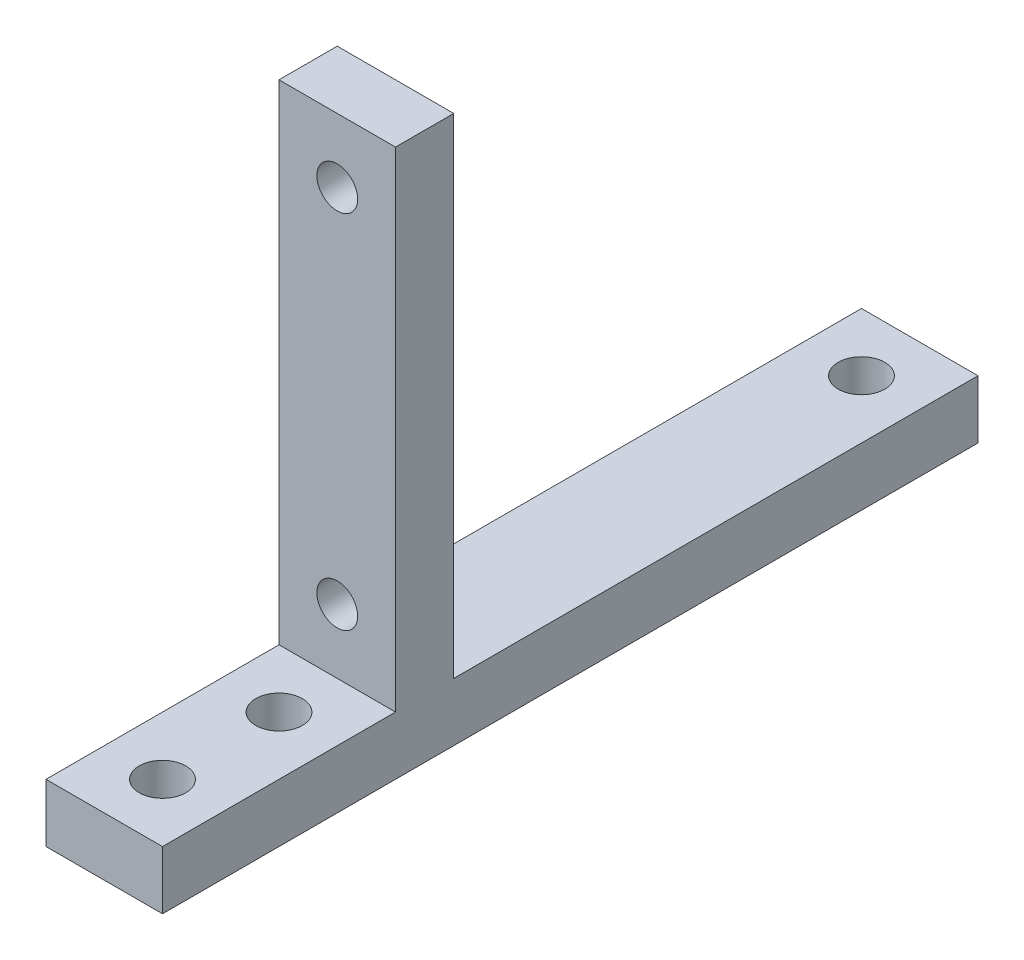
ISO-10303-21;
HEADER;
FILE_DESCRIPTION(('STEP AP214'),'2;1');
FILE_NAME('part.step','',(''),(''),'','','');
FILE_SCHEMA(('AUTOMOTIVE_DESIGN { 1 0 10303 214 1 1 1 1 }'));
ENDSEC;
DATA;
#1=APPLICATION_CONTEXT('core data for automotive mechanical design processes');
#2=APPLICATION_PROTOCOL_DEFINITION('international standard','automotive_design',2000,#1);
#3=PRODUCT_CONTEXT('',#1,'mechanical');
#4=PRODUCT('Part','Part','',(#3));
#5=PRODUCT_RELATED_PRODUCT_CATEGORY('part','',(#4));
#6=PRODUCT_DEFINITION_FORMATION('','',#4);
#7=PRODUCT_DEFINITION_CONTEXT('part definition',#1,'design');
#8=PRODUCT_DEFINITION('design','',#6,#7);
#9=PRODUCT_DEFINITION_SHAPE('','',#8);
#10=(LENGTH_UNIT() NAMED_UNIT(*) SI_UNIT(.MILLI.,.METRE.));
#11=(NAMED_UNIT(*) PLANE_ANGLE_UNIT() SI_UNIT($,.RADIAN.));
#12=(NAMED_UNIT(*) SI_UNIT($,.STERADIAN.) SOLID_ANGLE_UNIT());
#13=UNCERTAINTY_MEASURE_WITH_UNIT(LENGTH_MEASURE(1.E-05),#10,'distance_accuracy_value','');
#14=(GEOMETRIC_REPRESENTATION_CONTEXT(3) GLOBAL_UNCERTAINTY_ASSIGNED_CONTEXT((#13)) GLOBAL_UNIT_ASSIGNED_CONTEXT((#10,
#11,#12)) REPRESENTATION_CONTEXT('',''));
#15=CARTESIAN_POINT('',(0.,0.,0.));
#16=DIRECTION('',(0.,0.,1.));
#17=DIRECTION('',(1.,0.,0.));
#18=AXIS2_PLACEMENT_3D('',#15,#16,#17);
#19=CARTESIAN_POINT('',(0.,0.,5.));
#20=DIRECTION('',(0.,0.,1.));
#21=DIRECTION('',(1.,0.,0.));
#22=AXIS2_PLACEMENT_3D('',#19,#20,#21);
#23=PLANE('',#22);
#24=CARTESIAN_POINT('',(0.,15.5,5.));
#25=DIRECTION('',(0.,0.,1.));
#26=DIRECTION('',(1.,0.,0.));
#27=AXIS2_PLACEMENT_3D('',#24,#25,#26);
#28=CIRCLE('',#27,1.75);
#29=CARTESIAN_POINT('',(1.75,15.5,5.));
#30=VERTEX_POINT('',#29);
#31=EDGE_CURVE('E111',#30,#30,#28,.T.);
#32=ORIENTED_EDGE('',*,*,#31,.F.);
#33=EDGE_LOOP('',(#32));
#34=FACE_BOUND('',#33,.T.);
#35=DIRECTION('',(0.,-1.,0.));
#36=VECTOR('',#35,1.);
#37=CARTESIAN_POINT('',(-4.99999999999999,21.,5.));
#38=LINE('',#37,#36);
#39=CARTESIAN_POINT('',(-4.99999999999999,21.,5.));
#40=VERTEX_POINT('',#39);
#41=CARTESIAN_POINT('',(-4.99999999999999,-21.,5.));
#42=VERTEX_POINT('',#41);
#43=EDGE_CURVE('E101',#40,#42,#38,.T.);
#44=ORIENTED_EDGE('',*,*,#43,.T.);
#45=DIRECTION('',(1.,0.,0.));
#46=VECTOR('',#45,1.);
#47=CARTESIAN_POINT('',(-5.,-21.,5.));
#48=LINE('',#47,#46);
#49=CARTESIAN_POINT('',(5.00000000000001,-21.,5.));
#50=VERTEX_POINT('',#49);
#51=EDGE_CURVE('E87',#42,#50,#48,.T.);
#52=ORIENTED_EDGE('',*,*,#51,.T.);
#53=DIRECTION('',(0.,1.,0.));
#54=VECTOR('',#53,1.);
#55=CARTESIAN_POINT('',(5.00000000000001,-21.,5.));
#56=LINE('',#55,#54);
#57=CARTESIAN_POINT('',(5.00000000000001,21.,5.));
#58=VERTEX_POINT('',#57);
#59=EDGE_CURVE('E99',#50,#58,#56,.T.);
#60=ORIENTED_EDGE('',*,*,#59,.T.);
#61=DIRECTION('',(-1.,0.,0.));
#62=VECTOR('',#61,1.);
#63=CARTESIAN_POINT('',(-4.99999999999999,21.,5.));
#64=LINE('',#63,#62);
#65=EDGE_CURVE('E52',#58,#40,#64,.T.);
#66=ORIENTED_EDGE('',*,*,#65,.T.);
#67=EDGE_LOOP('',(#44,#52,#60,#66));
#68=FACE_BOUND('',#67,.T.);
#69=CARTESIAN_POINT('',(0.,-15.5,5.));
#70=DIRECTION('',(0.,0.,1.));
#71=DIRECTION('',(1.,0.,0.));
#72=AXIS2_PLACEMENT_3D('',#69,#70,#71);
#73=CIRCLE('',#72,1.75);
#74=CARTESIAN_POINT('',(1.75,-15.5,5.));
#75=VERTEX_POINT('',#74);
#76=EDGE_CURVE('E228',#75,#75,#73,.T.);
#77=ORIENTED_EDGE('',*,*,#76,.F.);
#78=EDGE_LOOP('',(#77));
#79=FACE_BOUND('',#78,.T.);
#80=ADVANCED_FACE('F35',(#34,#68,#79),#23,.T.);
#81=CARTESIAN_POINT('',(0.,0.,0.));
#82=DIRECTION('',(0.,0.,1.));
#83=DIRECTION('',(1.,0.,0.));
#84=AXIS2_PLACEMENT_3D('',#81,#82,#83);
#85=PLANE('',#84);
#86=DIRECTION('',(0.,-1.,0.));
#87=VECTOR('',#86,1.);
#88=CARTESIAN_POINT('',(-4.99999999999999,21.,0.));
#89=LINE('',#88,#87);
#90=CARTESIAN_POINT('',(-4.99999999999999,21.,0.));
#91=VERTEX_POINT('',#90);
#92=CARTESIAN_POINT('',(-4.99999999999999,-21.,0.));
#93=VERTEX_POINT('',#92);
#94=EDGE_CURVE('E108',#91,#93,#89,.T.);
#95=ORIENTED_EDGE('',*,*,#94,.F.);
#96=DIRECTION('',(-1.,0.,0.));
#97=VECTOR('',#96,1.);
#98=CARTESIAN_POINT('',(-4.99999999999999,21.,0.));
#99=LINE('',#98,#97);
#100=CARTESIAN_POINT('',(5.00000000000001,21.,0.));
#101=VERTEX_POINT('',#100);
#102=EDGE_CURVE('E114',#101,#91,#99,.T.);
#103=ORIENTED_EDGE('',*,*,#102,.F.);
#104=DIRECTION('',(0.,1.,0.));
#105=VECTOR('',#104,1.);
#106=CARTESIAN_POINT('',(5.00000000000001,-21.,0.));
#107=LINE('',#106,#105);
#108=CARTESIAN_POINT('',(5.00000000000001,-21.,0.));
#109=VERTEX_POINT('',#108);
#110=EDGE_CURVE('E64',#109,#101,#107,.T.);
#111=ORIENTED_EDGE('',*,*,#110,.F.);
#112=DIRECTION('',(1.,0.,0.));
#113=VECTOR('',#112,1.);
#114=CARTESIAN_POINT('',(-5.,-21.,0.));
#115=LINE('',#114,#113);
#116=EDGE_CURVE('E73',#93,#109,#115,.T.);
#117=ORIENTED_EDGE('',*,*,#116,.F.);
#118=EDGE_LOOP('',(#95,#103,#111,#117));
#119=FACE_BOUND('',#118,.T.);
#120=CARTESIAN_POINT('',(0.,15.5,0.));
#121=DIRECTION('',(0.,0.,1.));
#122=DIRECTION('',(1.,0.,0.));
#123=AXIS2_PLACEMENT_3D('',#120,#121,#122);
#124=CIRCLE('',#123,1.75);
#125=CARTESIAN_POINT('',(1.75,15.5,0.));
#126=VERTEX_POINT('',#125);
#127=EDGE_CURVE('E231',#126,#126,#124,.T.);
#128=ORIENTED_EDGE('',*,*,#127,.T.);
#129=EDGE_LOOP('',(#128));
#130=FACE_BOUND('',#129,.T.);
#131=CARTESIAN_POINT('',(0.,-15.5,0.));
#132=DIRECTION('',(0.,0.,1.));
#133=DIRECTION('',(1.,0.,0.));
#134=AXIS2_PLACEMENT_3D('',#131,#132,#133);
#135=CIRCLE('',#134,1.75);
#136=CARTESIAN_POINT('',(1.75,-15.5,0.));
#137=VERTEX_POINT('',#136);
#138=EDGE_CURVE('E227',#137,#137,#135,.T.);
#139=ORIENTED_EDGE('',*,*,#138,.T.);
#140=EDGE_LOOP('',(#139));
#141=FACE_BOUND('',#140,.T.);
#142=ADVANCED_FACE('F122',(#119,#130,#141),#85,.F.);
#143=CARTESIAN_POINT('',(-4.99999999999999,21.,5.));
#144=DIRECTION('',(1.,0.,0.));
#145=DIRECTION('',(0.,1.,0.));
#146=AXIS2_PLACEMENT_3D('',#143,#144,#145);
#147=PLANE('',#146);
#148=ORIENTED_EDGE('',*,*,#94,.T.);
#149=DIRECTION('',(0.,0.,-1.));
#150=VECTOR('',#149,1.);
#151=CARTESIAN_POINT('',(-5.,-21.,25.));
#152=LINE('',#151,#150);
#153=CARTESIAN_POINT('',(-4.99999999999999,-21.,-45.));
#154=VERTEX_POINT('',#153);
#155=EDGE_CURVE('E196',#93,#154,#152,.T.);
#156=ORIENTED_EDGE('',*,*,#155,.T.);
#157=DIRECTION('',(0.,1.,0.));
#158=VECTOR('',#157,1.);
#159=CARTESIAN_POINT('',(-4.99999999999999,-26.,-45.));
#160=LINE('',#159,#158);
#161=CARTESIAN_POINT('',(-4.99999999999999,-26.,-45.));
#162=VERTEX_POINT('',#161);
#163=EDGE_CURVE('E224',#162,#154,#160,.T.);
#164=ORIENTED_EDGE('',*,*,#163,.F.);
#165=DIRECTION('',(0.,0.,-1.));
#166=VECTOR('',#165,1.);
#167=CARTESIAN_POINT('',(-5.,-26.,25.));
#168=LINE('',#167,#166);
#169=CARTESIAN_POINT('',(-5.,-26.,25.));
#170=VERTEX_POINT('',#169);
#171=EDGE_CURVE('E199',#170,#162,#168,.T.);
#172=ORIENTED_EDGE('',*,*,#171,.F.);
#173=DIRECTION('',(0.,1.,0.));
#174=VECTOR('',#173,1.);
#175=CARTESIAN_POINT('',(-5.,-26.,25.));
#176=LINE('',#175,#174);
#177=CARTESIAN_POINT('',(-5.,-21.,25.));
#178=VERTEX_POINT('',#177);
#179=EDGE_CURVE('E211',#170,#178,#176,.T.);
#180=ORIENTED_EDGE('',*,*,#179,.T.);
#181=EDGE_CURVE('E212',#178,#42,#152,.T.);
#182=ORIENTED_EDGE('',*,*,#181,.T.);
#183=ORIENTED_EDGE('',*,*,#43,.F.);
#184=DIRECTION('',(0.,0.,-1.));
#185=VECTOR('',#184,1.);
#186=CARTESIAN_POINT('',(-4.99999999999999,21.,5.));
#187=LINE('',#186,#185);
#188=EDGE_CURVE('E44',#40,#91,#187,.T.);
#189=ORIENTED_EDGE('',*,*,#188,.T.);
#190=EDGE_LOOP('',(#148,#156,#164,#172,#180,#182,#183,#189));
#191=FACE_BOUND('',#190,.T.);
#192=ADVANCED_FACE('F37',(#191),#147,.F.);
#193=CARTESIAN_POINT('',(5.00000000000001,-21.,5.));
#194=DIRECTION('',(-1.,0.,0.));
#195=DIRECTION('',(0.,-1.,0.));
#196=AXIS2_PLACEMENT_3D('',#193,#194,#195);
#197=PLANE('',#196);
#198=ORIENTED_EDGE('',*,*,#110,.T.);
#199=DIRECTION('',(0.,0.,-1.));
#200=VECTOR('',#199,1.);
#201=CARTESIAN_POINT('',(5.00000000000001,21.,5.));
#202=LINE('',#201,#200);
#203=EDGE_CURVE('E11',#58,#101,#202,.T.);
#204=ORIENTED_EDGE('',*,*,#203,.F.);
#205=ORIENTED_EDGE('',*,*,#59,.F.);
#206=DIRECTION('',(0.,0.,1.));
#207=VECTOR('',#206,1.);
#208=CARTESIAN_POINT('',(5.00000000000001,-21.,25.));
#209=LINE('',#208,#207);
#210=CARTESIAN_POINT('',(5.00000000000001,-21.,25.));
#211=VERTEX_POINT('',#210);
#212=EDGE_CURVE('E82',#50,#211,#209,.T.);
#213=ORIENTED_EDGE('',*,*,#212,.T.);
#214=DIRECTION('',(0.,1.,0.));
#215=VECTOR('',#214,1.);
#216=CARTESIAN_POINT('',(5.00000000000001,-26.,25.));
#217=LINE('',#216,#215);
#218=CARTESIAN_POINT('',(5.00000000000001,-26.,25.));
#219=VERTEX_POINT('',#218);
#220=EDGE_CURVE('E219',#219,#211,#217,.T.);
#221=ORIENTED_EDGE('',*,*,#220,.F.);
#222=DIRECTION('',(0.,0.,1.));
#223=VECTOR('',#222,1.);
#224=CARTESIAN_POINT('',(5.00000000000001,-26.,25.));
#225=LINE('',#224,#223);
#226=CARTESIAN_POINT('',(5.00000000000002,-26.,-45.));
#227=VERTEX_POINT('',#226);
#228=EDGE_CURVE('E205',#227,#219,#225,.T.);
#229=ORIENTED_EDGE('',*,*,#228,.F.);
#230=DIRECTION('',(0.,1.,0.));
#231=VECTOR('',#230,1.);
#232=CARTESIAN_POINT('',(5.00000000000002,-26.,-45.));
#233=LINE('',#232,#231);
#234=CARTESIAN_POINT('',(5.00000000000002,-21.,-45.));
#235=VERTEX_POINT('',#234);
#236=EDGE_CURVE('E221',#227,#235,#233,.T.);
#237=ORIENTED_EDGE('',*,*,#236,.T.);
#238=EDGE_CURVE('E95',#235,#109,#209,.T.);
#239=ORIENTED_EDGE('',*,*,#238,.T.);
#240=EDGE_LOOP('',(#198,#204,#205,#213,#221,#229,#237,#239));
#241=FACE_BOUND('',#240,.T.);
#242=ADVANCED_FACE('F103',(#241),#197,.F.);
#243=CARTESIAN_POINT('',(-4.99999999999999,21.,5.));
#244=DIRECTION('',(0.,-1.,0.));
#245=DIRECTION('',(0.,0.,-1.));
#246=AXIS2_PLACEMENT_3D('',#243,#244,#245);
#247=PLANE('',#246);
#248=ORIENTED_EDGE('',*,*,#102,.T.);
#249=ORIENTED_EDGE('',*,*,#188,.F.);
#250=ORIENTED_EDGE('',*,*,#65,.F.);
#251=ORIENTED_EDGE('',*,*,#203,.T.);
#252=EDGE_LOOP('',(#248,#249,#250,#251));
#253=FACE_BOUND('',#252,.T.);
#254=ADVANCED_FACE('F124',(#253),#247,.F.);
#255=CARTESIAN_POINT('',(0.,15.5,5.));
#256=DIRECTION('',(0.,0.,-1.));
#257=DIRECTION('',(-1.,0.,0.));
#258=AXIS2_PLACEMENT_3D('',#255,#256,#257);
#259=CYLINDRICAL_SURFACE('',#258,1.75);
#260=ORIENTED_EDGE('',*,*,#31,.T.);
#261=EDGE_LOOP('',(#260));
#262=FACE_BOUND('',#261,.T.);
#263=ORIENTED_EDGE('',*,*,#127,.F.);
#264=EDGE_LOOP('',(#263));
#265=FACE_BOUND('',#264,.T.);
#266=ADVANCED_FACE('F126',(#262,#265),#259,.F.);
#267=CARTESIAN_POINT('',(0.,-15.5,5.));
#268=DIRECTION('',(0.,0.,-1.));
#269=DIRECTION('',(-1.,0.,0.));
#270=AXIS2_PLACEMENT_3D('',#267,#268,#269);
#271=CYLINDRICAL_SURFACE('',#270,1.75);
#272=ORIENTED_EDGE('',*,*,#76,.T.);
#273=EDGE_LOOP('',(#272));
#274=FACE_BOUND('',#273,.T.);
#275=ORIENTED_EDGE('',*,*,#138,.F.);
#276=EDGE_LOOP('',(#275));
#277=FACE_BOUND('',#276,.T.);
#278=ADVANCED_FACE('F132',(#274,#277),#271,.F.);
#279=CARTESIAN_POINT('',(0.,-21.,0.));
#280=DIRECTION('',(0.,-1.,0.));
#281=DIRECTION('',(0.,0.,-1.));
#282=AXIS2_PLACEMENT_3D('',#279,#280,#281);
#283=PLANE('',#282);
#284=CARTESIAN_POINT('',(0.,-21.,-40.));
#285=DIRECTION('',(0.,-1.,0.));
#286=DIRECTION('',(0.,0.,-1.));
#287=AXIS2_PLACEMENT_3D('',#284,#285,#286);
#288=CIRCLE('',#287,2.);
#289=CARTESIAN_POINT('',(0.,-21.,-42.));
#290=VERTEX_POINT('',#289);
#291=EDGE_CURVE('E184',#290,#290,#288,.T.);
#292=ORIENTED_EDGE('',*,*,#291,.T.);
#293=EDGE_LOOP('',(#292));
#294=FACE_BOUND('',#293,.T.);
#295=ORIENTED_EDGE('',*,*,#155,.F.);
#296=ORIENTED_EDGE('',*,*,#116,.T.);
#297=ORIENTED_EDGE('',*,*,#238,.F.);
#298=DIRECTION('',(1.,0.,0.));
#299=VECTOR('',#298,1.);
#300=CARTESIAN_POINT('',(-4.99999999999999,-21.,-45.));
#301=LINE('',#300,#299);
#302=EDGE_CURVE('E96',#154,#235,#301,.T.);
#303=ORIENTED_EDGE('',*,*,#302,.F.);
#304=EDGE_LOOP('',(#295,#296,#297,#303));
#305=FACE_BOUND('',#304,.T.);
#306=ADVANCED_FACE('F146',(#294,#305),#283,.F.);
#307=CARTESIAN_POINT('',(0.,-26.,0.));
#308=DIRECTION('',(0.,-1.,0.));
#309=DIRECTION('',(0.,0.,-1.));
#310=AXIS2_PLACEMENT_3D('',#307,#308,#309);
#311=PLANE('',#310);
#312=CARTESIAN_POINT('',(0.,-26.,-40.));
#313=DIRECTION('',(0.,-1.,0.));
#314=DIRECTION('',(0.,0.,-1.));
#315=AXIS2_PLACEMENT_3D('',#312,#313,#314);
#316=CIRCLE('',#315,2.);
#317=CARTESIAN_POINT('',(0.,-26.,-42.));
#318=VERTEX_POINT('',#317);
#319=EDGE_CURVE('E187',#318,#318,#316,.T.);
#320=ORIENTED_EDGE('',*,*,#319,.F.);
#321=EDGE_LOOP('',(#320));
#322=FACE_BOUND('',#321,.T.);
#323=ORIENTED_EDGE('',*,*,#171,.T.);
#324=DIRECTION('',(1.,0.,0.));
#325=VECTOR('',#324,1.);
#326=CARTESIAN_POINT('',(-4.99999999999999,-26.,-45.));
#327=LINE('',#326,#325);
#328=EDGE_CURVE('E202',#162,#227,#327,.T.);
#329=ORIENTED_EDGE('',*,*,#328,.T.);
#330=ORIENTED_EDGE('',*,*,#228,.T.);
#331=DIRECTION('',(-1.,0.,0.));
#332=VECTOR('',#331,1.);
#333=CARTESIAN_POINT('',(-5.,-26.,25.));
#334=LINE('',#333,#332);
#335=EDGE_CURVE('E208',#219,#170,#334,.T.);
#336=ORIENTED_EDGE('',*,*,#335,.T.);
#337=EDGE_LOOP('',(#323,#329,#330,#336));
#338=FACE_BOUND('',#337,.T.);
#339=CARTESIAN_POINT('',(0.,-26.,20.));
#340=DIRECTION('',(0.,-1.,0.));
#341=DIRECTION('',(0.,0.,-1.));
#342=AXIS2_PLACEMENT_3D('',#339,#340,#341);
#343=CIRCLE('',#342,2.);
#344=CARTESIAN_POINT('',(0.,-26.,18.));
#345=VERTEX_POINT('',#344);
#346=EDGE_CURVE('E193',#345,#345,#343,.T.);
#347=ORIENTED_EDGE('',*,*,#346,.F.);
#348=EDGE_LOOP('',(#347));
#349=FACE_BOUND('',#348,.T.);
#350=CARTESIAN_POINT('',(0.,-26.,10.));
#351=DIRECTION('',(0.,-1.,0.));
#352=DIRECTION('',(0.,0.,-1.));
#353=AXIS2_PLACEMENT_3D('',#350,#351,#352);
#354=CIRCLE('',#353,2.);
#355=CARTESIAN_POINT('',(0.,-26.,8.));
#356=VERTEX_POINT('',#355);
#357=EDGE_CURVE('E178',#356,#356,#354,.T.);
#358=ORIENTED_EDGE('',*,*,#357,.F.);
#359=EDGE_LOOP('',(#358));
#360=FACE_BOUND('',#359,.T.);
#361=ADVANCED_FACE('F159',(#322,#338,#349,#360),#311,.T.);
#362=ORIENTED_EDGE('',*,*,#51,.F.);
#363=ORIENTED_EDGE('',*,*,#181,.F.);
#364=DIRECTION('',(-1.,0.,0.));
#365=VECTOR('',#364,1.);
#366=CARTESIAN_POINT('',(-5.,-21.,25.));
#367=LINE('',#366,#365);
#368=EDGE_CURVE('E91',#211,#178,#367,.T.);
#369=ORIENTED_EDGE('',*,*,#368,.F.);
#370=ORIENTED_EDGE('',*,*,#212,.F.);
#371=EDGE_LOOP('',(#362,#363,#369,#370));
#372=FACE_BOUND('',#371,.T.);
#373=CARTESIAN_POINT('',(0.,-21.,20.));
#374=DIRECTION('',(0.,-1.,0.));
#375=DIRECTION('',(0.,0.,-1.));
#376=AXIS2_PLACEMENT_3D('',#373,#374,#375);
#377=CIRCLE('',#376,2.);
#378=CARTESIAN_POINT('',(0.,-21.,18.));
#379=VERTEX_POINT('',#378);
#380=EDGE_CURVE('E190',#379,#379,#377,.T.);
#381=ORIENTED_EDGE('',*,*,#380,.T.);
#382=EDGE_LOOP('',(#381));
#383=FACE_BOUND('',#382,.T.);
#384=CARTESIAN_POINT('',(0.,-21.,10.));
#385=DIRECTION('',(0.,-1.,0.));
#386=DIRECTION('',(0.,0.,-1.));
#387=AXIS2_PLACEMENT_3D('',#384,#385,#386);
#388=CIRCLE('',#387,2.);
#389=CARTESIAN_POINT('',(0.,-21.,8.));
#390=VERTEX_POINT('',#389);
#391=EDGE_CURVE('E181',#390,#390,#388,.T.);
#392=ORIENTED_EDGE('',*,*,#391,.T.);
#393=EDGE_LOOP('',(#392));
#394=FACE_BOUND('',#393,.T.);
#395=ADVANCED_FACE('F84',(#372,#383,#394),#283,.F.);
#396=CARTESIAN_POINT('',(-4.99999999999999,-26.,-45.));
#397=DIRECTION('',(0.,0.,1.));
#398=DIRECTION('',(1.,0.,0.));
#399=AXIS2_PLACEMENT_3D('',#396,#397,#398);
#400=PLANE('',#399);
#401=ORIENTED_EDGE('',*,*,#302,.T.);
#402=ORIENTED_EDGE('',*,*,#236,.F.);
#403=ORIENTED_EDGE('',*,*,#328,.F.);
#404=ORIENTED_EDGE('',*,*,#163,.T.);
#405=EDGE_LOOP('',(#401,#402,#403,#404));
#406=FACE_BOUND('',#405,.T.);
#407=ADVANCED_FACE('F148',(#406),#400,.F.);
#408=CARTESIAN_POINT('',(-5.,-26.,25.));
#409=DIRECTION('',(0.,0.,-1.));
#410=DIRECTION('',(-1.,0.,0.));
#411=AXIS2_PLACEMENT_3D('',#408,#409,#410);
#412=PLANE('',#411);
#413=ORIENTED_EDGE('',*,*,#368,.T.);
#414=ORIENTED_EDGE('',*,*,#179,.F.);
#415=ORIENTED_EDGE('',*,*,#335,.F.);
#416=ORIENTED_EDGE('',*,*,#220,.T.);
#417=EDGE_LOOP('',(#413,#414,#415,#416));
#418=FACE_BOUND('',#417,.T.);
#419=ADVANCED_FACE('F151',(#418),#412,.F.);
#420=CARTESIAN_POINT('',(0.,-26.,20.));
#421=DIRECTION('',(0.,1.,0.));
#422=DIRECTION('',(0.,0.,1.));
#423=AXIS2_PLACEMENT_3D('',#420,#421,#422);
#424=CYLINDRICAL_SURFACE('',#423,2.);
#425=ORIENTED_EDGE('',*,*,#346,.T.);
#426=EDGE_LOOP('',(#425));
#427=FACE_BOUND('',#426,.T.);
#428=ORIENTED_EDGE('',*,*,#380,.F.);
#429=EDGE_LOOP('',(#428));
#430=FACE_BOUND('',#429,.T.);
#431=ADVANCED_FACE('F155',(#427,#430),#424,.F.);
#432=CARTESIAN_POINT('',(0.,-26.,-40.));
#433=DIRECTION('',(0.,1.,0.));
#434=DIRECTION('',(0.,0.,1.));
#435=AXIS2_PLACEMENT_3D('',#432,#433,#434);
#436=CYLINDRICAL_SURFACE('',#435,2.);
#437=ORIENTED_EDGE('',*,*,#319,.T.);
#438=EDGE_LOOP('',(#437));
#439=FACE_BOUND('',#438,.T.);
#440=ORIENTED_EDGE('',*,*,#291,.F.);
#441=EDGE_LOOP('',(#440));
#442=FACE_BOUND('',#441,.T.);
#443=ADVANCED_FACE('F165',(#439,#442),#436,.F.);
#444=CARTESIAN_POINT('',(0.,-26.,10.));
#445=DIRECTION('',(0.,1.,0.));
#446=DIRECTION('',(0.,0.,1.));
#447=AXIS2_PLACEMENT_3D('',#444,#445,#446);
#448=CYLINDRICAL_SURFACE('',#447,2.);
#449=ORIENTED_EDGE('',*,*,#357,.T.);
#450=EDGE_LOOP('',(#449));
#451=FACE_BOUND('',#450,.T.);
#452=ORIENTED_EDGE('',*,*,#391,.F.);
#453=EDGE_LOOP('',(#452));
#454=FACE_BOUND('',#453,.T.);
#455=ADVANCED_FACE('F169',(#451,#454),#448,.F.);
#456=CLOSED_SHELL('',(#80,#142,#192,#242,#254,#266,#278,#306,#361,#395,#407,#419,#431,#443,#455));
#457=MANIFOLD_SOLID_BREP('B2',#456);
#458=ADVANCED_BREP_SHAPE_REPRESENTATION('',(#18,#457),#14);
#459=SHAPE_DEFINITION_REPRESENTATION(#9,#458);
ENDSEC;
END-ISO-10303-21;
